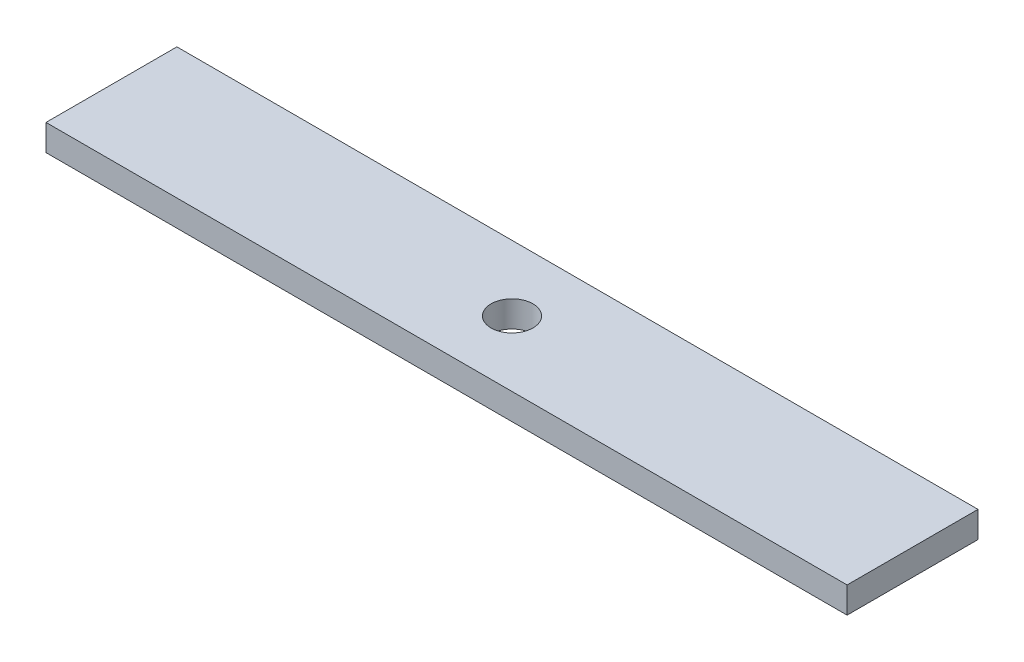
ISO-10303-21;
HEADER;
FILE_DESCRIPTION(('STEP AP214'),'2;1');
FILE_NAME('part.step','',(''),(''),'','','');
FILE_SCHEMA(('AUTOMOTIVE_DESIGN { 1 0 10303 214 1 1 1 1 }'));
ENDSEC;
DATA;
#1=APPLICATION_CONTEXT('core data for automotive mechanical design processes');
#2=APPLICATION_PROTOCOL_DEFINITION('international standard','automotive_design',2000,#1);
#3=PRODUCT_CONTEXT('',#1,'mechanical');
#4=PRODUCT('Part','Part','',(#3));
#5=PRODUCT_RELATED_PRODUCT_CATEGORY('part','',(#4));
#6=PRODUCT_DEFINITION_FORMATION('','',#4);
#7=PRODUCT_DEFINITION_CONTEXT('part definition',#1,'design');
#8=PRODUCT_DEFINITION('design','',#6,#7);
#9=PRODUCT_DEFINITION_SHAPE('','',#8);
#10=(LENGTH_UNIT() NAMED_UNIT(*) SI_UNIT(.MILLI.,.METRE.));
#11=(NAMED_UNIT(*) PLANE_ANGLE_UNIT() SI_UNIT($,.RADIAN.));
#12=(NAMED_UNIT(*) SI_UNIT($,.STERADIAN.) SOLID_ANGLE_UNIT());
#13=UNCERTAINTY_MEASURE_WITH_UNIT(LENGTH_MEASURE(1.E-05),#10,'distance_accuracy_value','');
#14=(GEOMETRIC_REPRESENTATION_CONTEXT(3) GLOBAL_UNCERTAINTY_ASSIGNED_CONTEXT((#13)) GLOBAL_UNIT_ASSIGNED_CONTEXT((#10,
#11,#12)) REPRESENTATION_CONTEXT('',''));
#15=CARTESIAN_POINT('',(0.,0.,0.));
#16=DIRECTION('',(0.,0.,1.));
#17=DIRECTION('',(1.,0.,0.));
#18=AXIS2_PLACEMENT_3D('',#15,#16,#17);
#19=CARTESIAN_POINT('',(0.,5.,0.));
#20=DIRECTION('',(0.,-1.,0.));
#21=DIRECTION('',(0.,0.,-1.));
#22=AXIS2_PLACEMENT_3D('',#19,#20,#21);
#23=PLANE('',#22);
#24=DIRECTION('',(0.,0.,-1.));
#25=VECTOR('',#24,1.);
#26=CARTESIAN_POINT('',(76.5,5.,0.));
#27=LINE('',#26,#25);
#28=CARTESIAN_POINT('',(76.5,5.,0.));
#29=VERTEX_POINT('',#28);
#30=CARTESIAN_POINT('',(76.5,5.,-25.));
#31=VERTEX_POINT('',#30);
#32=EDGE_CURVE('E85',#29,#31,#27,.T.);
#33=ORIENTED_EDGE('',*,*,#32,.T.);
#34=DIRECTION('',(-1.,0.,0.));
#35=VECTOR('',#34,1.);
#36=CARTESIAN_POINT('',(-76.5,5.,-25.));
#37=LINE('',#36,#35);
#38=CARTESIAN_POINT('',(-76.5,5.,-25.));
#39=VERTEX_POINT('',#38);
#40=EDGE_CURVE('E80',#31,#39,#37,.T.);
#41=ORIENTED_EDGE('',*,*,#40,.T.);
#42=DIRECTION('',(0.,0.,1.));
#43=VECTOR('',#42,1.);
#44=CARTESIAN_POINT('',(-76.5,5.,0.));
#45=LINE('',#44,#43);
#46=CARTESIAN_POINT('',(-76.5,5.,0.));
#47=VERTEX_POINT('',#46);
#48=EDGE_CURVE('E83',#39,#47,#45,.T.);
#49=ORIENTED_EDGE('',*,*,#48,.T.);
#50=DIRECTION('',(1.,0.,0.));
#51=VECTOR('',#50,1.);
#52=CARTESIAN_POINT('',(-76.5,5.,0.));
#53=LINE('',#52,#51);
#54=EDGE_CURVE('E50',#47,#29,#53,.T.);
#55=ORIENTED_EDGE('',*,*,#54,.T.);
#56=EDGE_LOOP('',(#33,#41,#49,#55));
#57=FACE_BOUND('',#56,.T.);
#58=CARTESIAN_POINT('',(0.,5.,-12.5));
#59=DIRECTION('',(0.,1.,0.));
#60=DIRECTION('',(0.,0.,1.));
#61=AXIS2_PLACEMENT_3D('',#58,#59,#60);
#62=CIRCLE('',#61,4.);
#63=CARTESIAN_POINT('',(0.,5.,-8.5));
#64=VERTEX_POINT('',#63);
#65=EDGE_CURVE('E100',#64,#64,#62,.T.);
#66=ORIENTED_EDGE('',*,*,#65,.F.);
#67=EDGE_LOOP('',(#66));
#68=FACE_BOUND('',#67,.T.);
#69=ADVANCED_FACE('F33',(#57,#68),#23,.F.);
#70=CARTESIAN_POINT('',(0.,0.,0.));
#71=DIRECTION('',(0.,-1.,0.));
#72=DIRECTION('',(0.,0.,-1.));
#73=AXIS2_PLACEMENT_3D('',#70,#71,#72);
#74=PLANE('',#73);
#75=DIRECTION('',(0.,0.,-1.));
#76=VECTOR('',#75,1.);
#77=CARTESIAN_POINT('',(76.5,0.,0.));
#78=LINE('',#77,#76);
#79=CARTESIAN_POINT('',(76.5,0.,0.));
#80=VERTEX_POINT('',#79);
#81=CARTESIAN_POINT('',(76.5,0.,-25.));
#82=VERTEX_POINT('',#81);
#83=EDGE_CURVE('E97',#80,#82,#78,.T.);
#84=ORIENTED_EDGE('',*,*,#83,.F.);
#85=DIRECTION('',(1.,0.,0.));
#86=VECTOR('',#85,1.);
#87=CARTESIAN_POINT('',(-76.5,0.,0.));
#88=LINE('',#87,#86);
#89=CARTESIAN_POINT('',(-76.5,0.,0.));
#90=VERTEX_POINT('',#89);
#91=EDGE_CURVE('E73',#90,#80,#88,.T.);
#92=ORIENTED_EDGE('',*,*,#91,.F.);
#93=DIRECTION('',(0.,0.,1.));
#94=VECTOR('',#93,1.);
#95=CARTESIAN_POINT('',(-76.5,0.,0.));
#96=LINE('',#95,#94);
#97=CARTESIAN_POINT('',(-76.5,0.,-25.));
#98=VERTEX_POINT('',#97);
#99=EDGE_CURVE('E67',#98,#90,#96,.T.);
#100=ORIENTED_EDGE('',*,*,#99,.F.);
#101=DIRECTION('',(-1.,0.,0.));
#102=VECTOR('',#101,1.);
#103=CARTESIAN_POINT('',(-76.5,0.,-25.));
#104=LINE('',#103,#102);
#105=EDGE_CURVE('E89',#82,#98,#104,.T.);
#106=ORIENTED_EDGE('',*,*,#105,.F.);
#107=EDGE_LOOP('',(#84,#92,#100,#106));
#108=FACE_BOUND('',#107,.T.);
#109=CARTESIAN_POINT('',(0.,0.,-12.5));
#110=DIRECTION('',(0.,1.,0.));
#111=DIRECTION('',(0.,0.,1.));
#112=AXIS2_PLACEMENT_3D('',#109,#110,#111);
#113=CIRCLE('',#112,4.);
#114=CARTESIAN_POINT('',(0.,0.,-8.5));
#115=VERTEX_POINT('',#114);
#116=EDGE_CURVE('E112',#115,#115,#113,.T.);
#117=ORIENTED_EDGE('',*,*,#116,.T.);
#118=EDGE_LOOP('',(#117));
#119=FACE_BOUND('',#118,.T.);
#120=ADVANCED_FACE('F108',(#108,#119),#74,.T.);
#121=CARTESIAN_POINT('',(76.5,5.,0.));
#122=DIRECTION('',(-1.,0.,0.));
#123=DIRECTION('',(0.,0.,1.));
#124=AXIS2_PLACEMENT_3D('',#121,#122,#123);
#125=PLANE('',#124);
#126=ORIENTED_EDGE('',*,*,#83,.T.);
#127=DIRECTION('',(0.,-1.,0.));
#128=VECTOR('',#127,1.);
#129=CARTESIAN_POINT('',(76.5,5.,-25.));
#130=LINE('',#129,#128);
#131=EDGE_CURVE('E11',#31,#82,#130,.T.);
#132=ORIENTED_EDGE('',*,*,#131,.F.);
#133=ORIENTED_EDGE('',*,*,#32,.F.);
#134=DIRECTION('',(0.,-1.,0.));
#135=VECTOR('',#134,1.);
#136=CARTESIAN_POINT('',(76.5,5.,0.));
#137=LINE('',#136,#135);
#138=EDGE_CURVE('E93',#29,#80,#137,.T.);
#139=ORIENTED_EDGE('',*,*,#138,.T.);
#140=EDGE_LOOP('',(#126,#132,#133,#139));
#141=FACE_BOUND('',#140,.T.);
#142=ADVANCED_FACE('F35',(#141),#125,.F.);
#143=CARTESIAN_POINT('',(-76.5,5.,-25.));
#144=DIRECTION('',(0.,0.,1.));
#145=DIRECTION('',(1.,0.,0.));
#146=AXIS2_PLACEMENT_3D('',#143,#144,#145);
#147=PLANE('',#146);
#148=ORIENTED_EDGE('',*,*,#105,.T.);
#149=DIRECTION('',(0.,-1.,0.));
#150=VECTOR('',#149,1.);
#151=CARTESIAN_POINT('',(-76.5,5.,-25.));
#152=LINE('',#151,#150);
#153=EDGE_CURVE('E42',#39,#98,#152,.T.);
#154=ORIENTED_EDGE('',*,*,#153,.F.);
#155=ORIENTED_EDGE('',*,*,#40,.F.);
#156=ORIENTED_EDGE('',*,*,#131,.T.);
#157=EDGE_LOOP('',(#148,#154,#155,#156));
#158=FACE_BOUND('',#157,.T.);
#159=ADVANCED_FACE('F88',(#158),#147,.F.);
#160=CARTESIAN_POINT('',(-76.5,5.,0.));
#161=DIRECTION('',(1.,0.,0.));
#162=DIRECTION('',(0.,0.,-1.));
#163=AXIS2_PLACEMENT_3D('',#160,#161,#162);
#164=PLANE('',#163);
#165=ORIENTED_EDGE('',*,*,#99,.T.);
#166=DIRECTION('',(0.,-1.,0.));
#167=VECTOR('',#166,1.);
#168=CARTESIAN_POINT('',(-76.5,5.,0.));
#169=LINE('',#168,#167);
#170=EDGE_CURVE('E90',#47,#90,#169,.T.);
#171=ORIENTED_EDGE('',*,*,#170,.F.);
#172=ORIENTED_EDGE('',*,*,#48,.F.);
#173=ORIENTED_EDGE('',*,*,#153,.T.);
#174=EDGE_LOOP('',(#165,#171,#172,#173));
#175=FACE_BOUND('',#174,.T.);
#176=ADVANCED_FACE('F91',(#175),#164,.F.);
#177=CARTESIAN_POINT('',(-76.5,5.,0.));
#178=DIRECTION('',(0.,0.,-1.));
#179=DIRECTION('',(-1.,0.,0.));
#180=AXIS2_PLACEMENT_3D('',#177,#178,#179);
#181=PLANE('',#180);
#182=ORIENTED_EDGE('',*,*,#91,.T.);
#183=ORIENTED_EDGE('',*,*,#138,.F.);
#184=ORIENTED_EDGE('',*,*,#54,.F.);
#185=ORIENTED_EDGE('',*,*,#170,.T.);
#186=EDGE_LOOP('',(#182,#183,#184,#185));
#187=FACE_BOUND('',#186,.T.);
#188=ADVANCED_FACE('F105',(#187),#181,.F.);
#189=CARTESIAN_POINT('',(0.,5.,-12.5));
#190=DIRECTION('',(0.,-1.,0.));
#191=DIRECTION('',(0.,0.,-1.));
#192=AXIS2_PLACEMENT_3D('',#189,#190,#191);
#193=CYLINDRICAL_SURFACE('',#192,4.);
#194=ORIENTED_EDGE('',*,*,#65,.T.);
#195=EDGE_LOOP('',(#194));
#196=FACE_BOUND('',#195,.T.);
#197=ORIENTED_EDGE('',*,*,#116,.F.);
#198=EDGE_LOOP('',(#197));
#199=FACE_BOUND('',#198,.T.);
#200=ADVANCED_FACE('F118',(#196,#199),#193,.F.);
#201=CLOSED_SHELL('',(#69,#120,#142,#159,#176,#188,#200));
#202=MANIFOLD_SOLID_BREP('B2',#201);
#203=ADVANCED_BREP_SHAPE_REPRESENTATION('',(#18,#202),#14);
#204=SHAPE_DEFINITION_REPRESENTATION(#9,#203);
ENDSEC;
END-ISO-10303-21;
